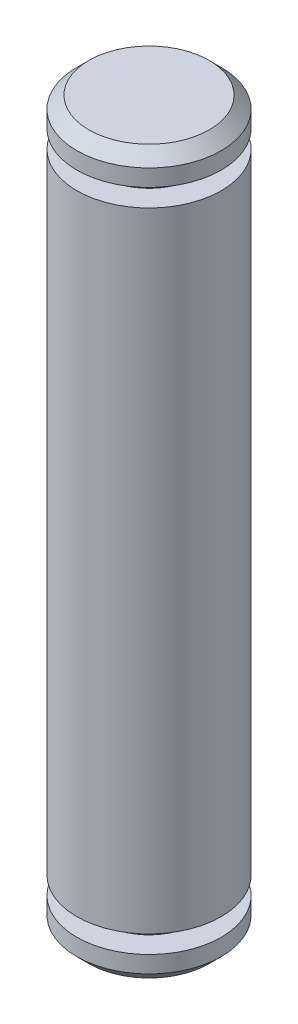
ISO-10303-21;
HEADER;
FILE_DESCRIPTION(('STEP AP214'),'2;1');
FILE_NAME('part.step','',(''),(''),'','','');
FILE_SCHEMA(('AUTOMOTIVE_DESIGN { 1 0 10303 214 1 1 1 1 }'));
ENDSEC;
DATA;
#1=APPLICATION_CONTEXT('core data for automotive mechanical design processes');
#2=APPLICATION_PROTOCOL_DEFINITION('international standard','automotive_design',2000,#1);
#3=PRODUCT_CONTEXT('',#1,'mechanical');
#4=PRODUCT('Part','Part','',(#3));
#5=PRODUCT_RELATED_PRODUCT_CATEGORY('part','',(#4));
#6=PRODUCT_DEFINITION_FORMATION('','',#4);
#7=PRODUCT_DEFINITION_CONTEXT('part definition',#1,'design');
#8=PRODUCT_DEFINITION('design','',#6,#7);
#9=PRODUCT_DEFINITION_SHAPE('','',#8);
#10=(LENGTH_UNIT() NAMED_UNIT(*) SI_UNIT(.MILLI.,.METRE.));
#11=(NAMED_UNIT(*) PLANE_ANGLE_UNIT() SI_UNIT($,.RADIAN.));
#12=(NAMED_UNIT(*) SI_UNIT($,.STERADIAN.) SOLID_ANGLE_UNIT());
#13=UNCERTAINTY_MEASURE_WITH_UNIT(LENGTH_MEASURE(1.E-05),#10,'distance_accuracy_value','');
#14=(GEOMETRIC_REPRESENTATION_CONTEXT(3) GLOBAL_UNCERTAINTY_ASSIGNED_CONTEXT((#13)) GLOBAL_UNIT_ASSIGNED_CONTEXT((#10,
#11,#12)) REPRESENTATION_CONTEXT('',''));
#15=CARTESIAN_POINT('',(0.,0.,0.));
#16=DIRECTION('',(0.,0.,1.));
#17=DIRECTION('',(1.,0.,0.));
#18=AXIS2_PLACEMENT_3D('',#15,#16,#17);
#19=CARTESIAN_POINT('',(0.,30.,0.));
#20=DIRECTION('',(0.,-1.,0.));
#21=DIRECTION('',(0.,0.,-1.));
#22=AXIS2_PLACEMENT_3D('',#19,#20,#21);
#23=CYLINDRICAL_SURFACE('',#22,3.);
#24=CARTESIAN_POINT('',(0.,29.5,0.));
#25=DIRECTION('',(0.,1.,0.));
#26=DIRECTION('',(0.,0.,1.));
#27=AXIS2_PLACEMENT_3D('',#24,#25,#26);
#28=CIRCLE('',#27,3.);
#29=CARTESIAN_POINT('',(0.,29.5,3.));
#30=VERTEX_POINT('',#29);
#31=EDGE_CURVE('E10',#30,#30,#28,.F.);
#32=ORIENTED_EDGE('',*,*,#31,.T.);
#33=EDGE_LOOP('',(#32));
#34=FACE_BOUND('',#33,.T.);
#35=CARTESIAN_POINT('',(0.,28.7999999999999,0.));
#36=DIRECTION('',(0.,-1.,0.));
#37=DIRECTION('',(1.,0.,0.));
#38=AXIS2_PLACEMENT_3D('',#35,#36,#37);
#39=CIRCLE('',#38,3.0000000000001);
#40=CARTESIAN_POINT('',(3.,28.7999999999999,0.));
#41=VERTEX_POINT('',#40);
#42=EDGE_CURVE('E60',#41,#41,#39,.T.);
#43=ORIENTED_EDGE('',*,*,#42,.F.);
#44=EDGE_LOOP('',(#43));
#45=FACE_BOUND('',#44,.T.);
#46=ADVANCED_FACE('F35',(#34,#45),#23,.T.);
#47=CARTESIAN_POINT('',(0.,30.,0.));
#48=DIRECTION('',(0.,1.,0.));
#49=DIRECTION('',(0.,0.,1.));
#50=AXIS2_PLACEMENT_3D('',#47,#48,#49);
#51=PLANE('',#50);
#52=CARTESIAN_POINT('',(0.,30.,0.));
#53=DIRECTION('',(0.,1.,0.));
#54=DIRECTION('',(0.,0.,1.));
#55=AXIS2_PLACEMENT_3D('',#52,#53,#54);
#56=CIRCLE('',#55,2.5);
#57=CARTESIAN_POINT('',(0.,30.,2.5));
#58=VERTEX_POINT('',#57);
#59=EDGE_CURVE('E43',#58,#58,#56,.T.);
#60=ORIENTED_EDGE('',*,*,#59,.T.);
#61=EDGE_LOOP('',(#60));
#62=FACE_BOUND('',#61,.T.);
#63=ADVANCED_FACE('F84',(#62),#51,.T.);
#64=CARTESIAN_POINT('',(3.,28.06,0.));
#65=DIRECTION('',(0.,-1.,0.));
#66=DIRECTION('',(1.,0.,0.));
#67=AXIS2_PLACEMENT_3D('',#64,#65,#66);
#68=PLANE('',#67);
#69=CARTESIAN_POINT('',(0.,28.06,0.));
#70=DIRECTION('',(0.,-1.,0.));
#71=DIRECTION('',(1.,0.,0.));
#72=AXIS2_PLACEMENT_3D('',#69,#70,#71);
#73=CIRCLE('',#72,3.0000000000001);
#74=CARTESIAN_POINT('',(3.,28.06,0.));
#75=VERTEX_POINT('',#74);
#76=EDGE_CURVE('E56',#75,#75,#73,.T.);
#77=ORIENTED_EDGE('',*,*,#76,.F.);
#78=EDGE_LOOP('',(#77));
#79=FACE_BOUND('',#78,.T.);
#80=CARTESIAN_POINT('',(0.,28.06,0.));
#81=DIRECTION('',(0.,-1.,0.));
#82=DIRECTION('',(1.,0.,0.));
#83=AXIS2_PLACEMENT_3D('',#80,#81,#82);
#84=CIRCLE('',#83,2.0000000000001);
#85=CARTESIAN_POINT('',(2.,28.06,0.));
#86=VERTEX_POINT('',#85);
#87=EDGE_CURVE('E72',#86,#86,#84,.T.);
#88=ORIENTED_EDGE('',*,*,#87,.T.);
#89=EDGE_LOOP('',(#88));
#90=FACE_BOUND('',#89,.T.);
#91=ADVANCED_FACE('F91',(#79,#90),#68,.F.);
#92=CARTESIAN_POINT('',(3.43024899888577E-12,-1000.,0.));
#93=DIRECTION('',(0.,-1.,0.));
#94=DIRECTION('',(1.,0.,0.));
#95=AXIS2_PLACEMENT_3D('',#92,#93,#94);
#96=CYLINDRICAL_SURFACE('',#95,2.0000000000001);
#97=ORIENTED_EDGE('',*,*,#87,.F.);
#98=EDGE_LOOP('',(#97));
#99=FACE_BOUND('',#98,.T.);
#100=CARTESIAN_POINT('',(0.,28.7999999999999,0.));
#101=DIRECTION('',(0.,-1.,0.));
#102=DIRECTION('',(1.,0.,0.));
#103=AXIS2_PLACEMENT_3D('',#100,#101,#102);
#104=CIRCLE('',#103,2.0000000000001);
#105=CARTESIAN_POINT('',(2.,28.7999999999999,0.));
#106=VERTEX_POINT('',#105);
#107=EDGE_CURVE('E75',#106,#106,#104,.T.);
#108=ORIENTED_EDGE('',*,*,#107,.T.);
#109=EDGE_LOOP('',(#108));
#110=FACE_BOUND('',#109,.T.);
#111=ADVANCED_FACE('F133',(#99,#110),#96,.T.);
#112=CARTESIAN_POINT('',(3.,28.8,0.));
#113=DIRECTION('',(0.,1.,0.));
#114=DIRECTION('',(-1.,0.,0.));
#115=AXIS2_PLACEMENT_3D('',#112,#113,#114);
#116=PLANE('',#115);
#117=ORIENTED_EDGE('',*,*,#107,.F.);
#118=EDGE_LOOP('',(#117));
#119=FACE_BOUND('',#118,.T.);
#120=ORIENTED_EDGE('',*,*,#42,.T.);
#121=EDGE_LOOP('',(#120));
#122=FACE_BOUND('',#121,.T.);
#123=ADVANCED_FACE('F81',(#119,#122),#116,.F.);
#124=ORIENTED_EDGE('',*,*,#76,.T.);
#125=EDGE_LOOP('',(#124));
#126=FACE_BOUND('',#125,.T.);
#127=CARTESIAN_POINT('',(0.,1.94000000000005,0.));
#128=DIRECTION('',(0.,-1.,0.));
#129=DIRECTION('',(1.,0.,0.));
#130=AXIS2_PLACEMENT_3D('',#127,#128,#129);
#131=CIRCLE('',#130,3.00000000000001);
#132=CARTESIAN_POINT('',(3.,1.94000000000006,0.));
#133=VERTEX_POINT('',#132);
#134=EDGE_CURVE('E64',#133,#133,#131,.T.);
#135=ORIENTED_EDGE('',*,*,#134,.F.);
#136=EDGE_LOOP('',(#135));
#137=FACE_BOUND('',#136,.T.);
#138=ADVANCED_FACE('F86',(#126,#137),#23,.T.);
#139=CARTESIAN_POINT('',(3.,1.20000000000002,0.));
#140=DIRECTION('',(0.,-1.,0.));
#141=DIRECTION('',(1.,0.,0.));
#142=AXIS2_PLACEMENT_3D('',#139,#140,#141);
#143=PLANE('',#142);
#144=CARTESIAN_POINT('',(0.,1.20000000000009,0.));
#145=DIRECTION('',(0.,-1.,0.));
#146=DIRECTION('',(1.,0.,0.));
#147=AXIS2_PLACEMENT_3D('',#144,#145,#146);
#148=CIRCLE('',#147,3.);
#149=CARTESIAN_POINT('',(3.,1.2000000000001,0.));
#150=VERTEX_POINT('',#149);
#151=EDGE_CURVE('E67',#150,#150,#148,.T.);
#152=ORIENTED_EDGE('',*,*,#151,.F.);
#153=EDGE_LOOP('',(#152));
#154=FACE_BOUND('',#153,.T.);
#155=CARTESIAN_POINT('',(0.,1.20000000000009,0.));
#156=DIRECTION('',(0.,-1.,0.));
#157=DIRECTION('',(1.,0.,0.));
#158=AXIS2_PLACEMENT_3D('',#155,#156,#157);
#159=CIRCLE('',#158,2.);
#160=CARTESIAN_POINT('',(2.,1.2000000000001,0.));
#161=VERTEX_POINT('',#160);
#162=EDGE_CURVE('E57',#161,#161,#159,.T.);
#163=ORIENTED_EDGE('',*,*,#162,.T.);
#164=EDGE_LOOP('',(#163));
#165=FACE_BOUND('',#164,.T.);
#166=ADVANCED_FACE('F95',(#154,#165),#143,.F.);
#167=CARTESIAN_POINT('',(3.43024899888577E-12,-1000.,0.));
#168=DIRECTION('',(0.,-1.,0.));
#169=DIRECTION('',(1.,0.,0.));
#170=AXIS2_PLACEMENT_3D('',#167,#168,#169);
#171=CYLINDRICAL_SURFACE('',#170,2.00000000000001);
#172=ORIENTED_EDGE('',*,*,#162,.F.);
#173=EDGE_LOOP('',(#172));
#174=FACE_BOUND('',#173,.T.);
#175=CARTESIAN_POINT('',(0.,1.94000000000005,0.));
#176=DIRECTION('',(0.,-1.,0.));
#177=DIRECTION('',(1.,0.,0.));
#178=AXIS2_PLACEMENT_3D('',#175,#176,#177);
#179=CIRCLE('',#178,2.00000000000001);
#180=CARTESIAN_POINT('',(2.,1.94000000000006,0.));
#181=VERTEX_POINT('',#180);
#182=EDGE_CURVE('E61',#181,#181,#179,.T.);
#183=ORIENTED_EDGE('',*,*,#182,.T.);
#184=EDGE_LOOP('',(#183));
#185=FACE_BOUND('',#184,.T.);
#186=ADVANCED_FACE('F114',(#174,#185),#171,.T.);
#187=CARTESIAN_POINT('',(3.,1.94000000000002,0.));
#188=DIRECTION('',(0.,1.,0.));
#189=DIRECTION('',(-1.,0.,0.));
#190=AXIS2_PLACEMENT_3D('',#187,#188,#189);
#191=PLANE('',#190);
#192=ORIENTED_EDGE('',*,*,#182,.F.);
#193=EDGE_LOOP('',(#192));
#194=FACE_BOUND('',#193,.T.);
#195=ORIENTED_EDGE('',*,*,#134,.T.);
#196=EDGE_LOOP('',(#195));
#197=FACE_BOUND('',#196,.T.);
#198=ADVANCED_FACE('F106',(#194,#197),#191,.F.);
#199=CARTESIAN_POINT('',(0.,0.,0.));
#200=DIRECTION('',(0.,1.,0.));
#201=DIRECTION('',(0.,0.,1.));
#202=AXIS2_PLACEMENT_3D('',#199,#200,#201);
#203=PLANE('',#202);
#204=CARTESIAN_POINT('',(0.,0.,0.));
#205=DIRECTION('',(0.,1.,0.));
#206=DIRECTION('',(0.,0.,1.));
#207=AXIS2_PLACEMENT_3D('',#204,#205,#206);
#208=CIRCLE('',#207,2.49999999999999);
#209=CARTESIAN_POINT('',(0.,0.,2.49999999999999));
#210=VERTEX_POINT('',#209);
#211=EDGE_CURVE('E47',#210,#210,#208,.F.);
#212=ORIENTED_EDGE('',*,*,#211,.T.);
#213=EDGE_LOOP('',(#212));
#214=FACE_BOUND('',#213,.T.);
#215=ADVANCED_FACE('F99',(#214),#203,.F.);
#216=CARTESIAN_POINT('',(0.,0.500000000000007,0.));
#217=DIRECTION('',(0.,1.,0.));
#218=DIRECTION('',(0.,0.,1.));
#219=AXIS2_PLACEMENT_3D('',#216,#217,#218);
#220=CIRCLE('',#219,3.);
#221=CARTESIAN_POINT('',(0.,0.500000000000007,3.));
#222=VERTEX_POINT('',#221);
#223=EDGE_CURVE('E51',#222,#222,#220,.T.);
#224=ORIENTED_EDGE('',*,*,#223,.T.);
#225=EDGE_LOOP('',(#224));
#226=FACE_BOUND('',#225,.T.);
#227=ORIENTED_EDGE('',*,*,#151,.T.);
#228=EDGE_LOOP('',(#227));
#229=FACE_BOUND('',#228,.T.);
#230=ADVANCED_FACE('F87',(#226,#229),#23,.T.);
#231=CARTESIAN_POINT('',(0.,0.500000000000007,0.));
#232=DIRECTION('',(0.,1.,0.));
#233=DIRECTION('',(0.,0.,1.));
#234=AXIS2_PLACEMENT_3D('',#231,#232,#233);
#235=CONICAL_SURFACE('',#234,3.,0.785398163397449);
#236=ORIENTED_EDGE('',*,*,#211,.F.);
#237=EDGE_LOOP('',(#236));
#238=FACE_BOUND('',#237,.T.);
#239=ORIENTED_EDGE('',*,*,#223,.F.);
#240=EDGE_LOOP('',(#239));
#241=FACE_BOUND('',#240,.T.);
#242=ADVANCED_FACE('F98',(#238,#241),#235,.T.);
#243=CARTESIAN_POINT('',(0.,30.,0.));
#244=DIRECTION('',(0.,-1.,0.));
#245=DIRECTION('',(0.,0.,-1.));
#246=AXIS2_PLACEMENT_3D('',#243,#244,#245);
#247=CONICAL_SURFACE('',#246,2.5,0.78539816339745);
#248=ORIENTED_EDGE('',*,*,#31,.F.);
#249=EDGE_LOOP('',(#248));
#250=FACE_BOUND('',#249,.T.);
#251=ORIENTED_EDGE('',*,*,#59,.F.);
#252=EDGE_LOOP('',(#251));
#253=FACE_BOUND('',#252,.T.);
#254=ADVANCED_FACE('F38',(#250,#253),#247,.T.);
#255=CLOSED_SHELL('',(#46,#63,#91,#111,#123,#138,#166,#186,#198,#215,#230,#242,#254));
#256=MANIFOLD_SOLID_BREP('B2',#255);
#257=ADVANCED_BREP_SHAPE_REPRESENTATION('',(#18,#256),#14);
#258=SHAPE_DEFINITION_REPRESENTATION(#9,#257);
ENDSEC;
END-ISO-10303-21;
